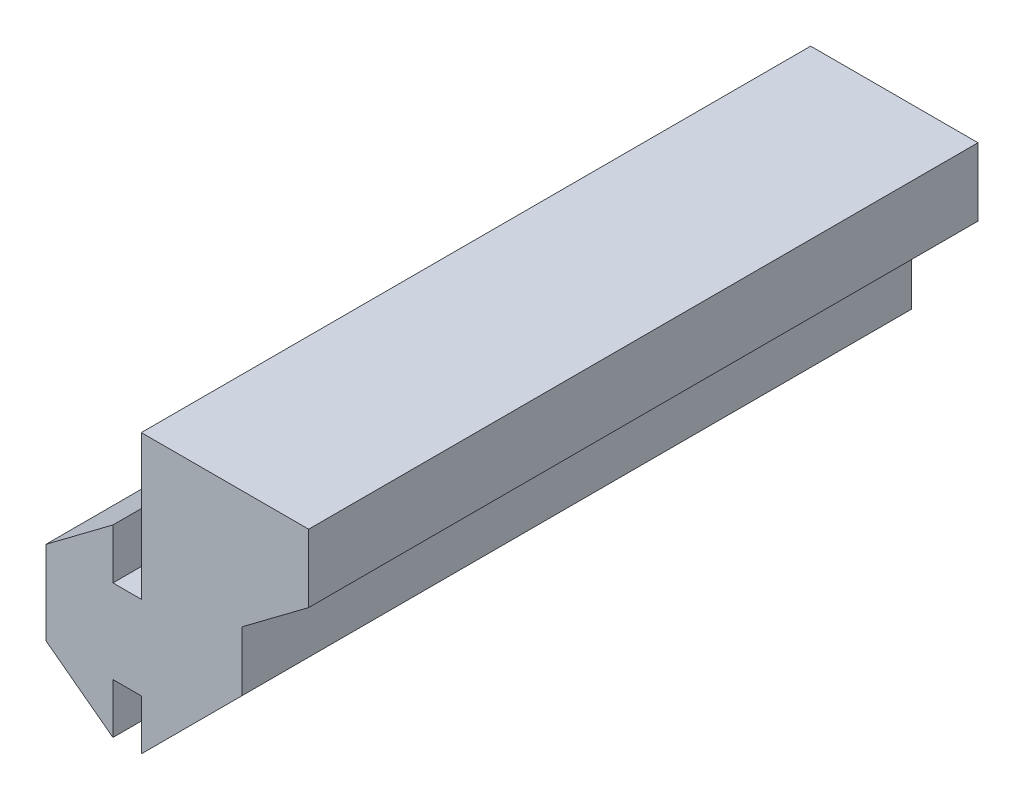
ISO-10303-21;
HEADER;
FILE_DESCRIPTION(('STEP AP214'),'2;1');
FILE_NAME('part.step','',(''),(''),'','','');
FILE_SCHEMA(('AUTOMOTIVE_DESIGN { 1 0 10303 214 1 1 1 1 }'));
ENDSEC;
DATA;
#1=APPLICATION_CONTEXT('core data for automotive mechanical design processes');
#2=APPLICATION_PROTOCOL_DEFINITION('international standard','automotive_design',2000,#1);
#3=PRODUCT_CONTEXT('',#1,'mechanical');
#4=PRODUCT('Part','Part','',(#3));
#5=PRODUCT_RELATED_PRODUCT_CATEGORY('part','',(#4));
#6=PRODUCT_DEFINITION_FORMATION('','',#4);
#7=PRODUCT_DEFINITION_CONTEXT('part definition',#1,'design');
#8=PRODUCT_DEFINITION('design','',#6,#7);
#9=PRODUCT_DEFINITION_SHAPE('','',#8);
#10=(LENGTH_UNIT() NAMED_UNIT(*) SI_UNIT(.MILLI.,.METRE.));
#11=(NAMED_UNIT(*) PLANE_ANGLE_UNIT() SI_UNIT($,.RADIAN.));
#12=(NAMED_UNIT(*) SI_UNIT($,.STERADIAN.) SOLID_ANGLE_UNIT());
#13=UNCERTAINTY_MEASURE_WITH_UNIT(LENGTH_MEASURE(1.E-05),#10,'distance_accuracy_value','');
#14=(GEOMETRIC_REPRESENTATION_CONTEXT(3) GLOBAL_UNCERTAINTY_ASSIGNED_CONTEXT((#13)) GLOBAL_UNIT_ASSIGNED_CONTEXT((#10,
#11,#12)) REPRESENTATION_CONTEXT('',''));
#15=CARTESIAN_POINT('',(0.,0.,0.));
#16=DIRECTION('',(0.,0.,1.));
#17=DIRECTION('',(1.,0.,0.));
#18=AXIS2_PLACEMENT_3D('',#15,#16,#17);
#19=CARTESIAN_POINT('',(0.,0.,40.));
#20=DIRECTION('',(0.6,0.8,0.));
#21=DIRECTION('',(-0.8,0.6,0.));
#22=AXIS2_PLACEMENT_3D('',#19,#20,#21);
#23=PLANE('',#22);
#24=DIRECTION('',(0.8,-0.6,0.));
#25=VECTOR('',#24,1.);
#26=CARTESIAN_POINT('',(0.,0.,0.));
#27=LINE('',#26,#25);
#28=CARTESIAN_POINT('',(0.,0.,0.));
#29=VERTEX_POINT('',#28);
#30=CARTESIAN_POINT('',(4.,-3.,0.));
#31=VERTEX_POINT('',#30);
#32=EDGE_CURVE('E165',#29,#31,#27,.T.);
#33=ORIENTED_EDGE('',*,*,#32,.T.);
#34=DIRECTION('',(0.,0.,-1.));
#35=VECTOR('',#34,1.);
#36=CARTESIAN_POINT('',(4.,-3.,40.));
#37=LINE('',#36,#35);
#38=CARTESIAN_POINT('',(4.,-3.,40.));
#39=VERTEX_POINT('',#38);
#40=EDGE_CURVE('E11',#39,#31,#37,.T.);
#41=ORIENTED_EDGE('',*,*,#40,.F.);
#42=DIRECTION('',(0.8,-0.6,0.));
#43=VECTOR('',#42,1.);
#44=CARTESIAN_POINT('',(0.,0.,40.));
#45=LINE('',#44,#43);
#46=CARTESIAN_POINT('',(0.,0.,40.));
#47=VERTEX_POINT('',#46);
#48=EDGE_CURVE('E191',#47,#39,#45,.T.);
#49=ORIENTED_EDGE('',*,*,#48,.F.);
#50=DIRECTION('',(0.,0.,-1.));
#51=VECTOR('',#50,1.);
#52=CARTESIAN_POINT('',(0.,0.,40.));
#53=LINE('',#52,#51);
#54=EDGE_CURVE('E161',#47,#29,#53,.T.);
#55=ORIENTED_EDGE('',*,*,#54,.T.);
#56=EDGE_LOOP('',(#33,#41,#49,#55));
#57=FACE_BOUND('',#56,.T.);
#58=ADVANCED_FACE('F33',(#57),#23,.F.);
#59=CARTESIAN_POINT('',(4.,0.,40.));
#60=DIRECTION('',(-1.,0.,0.));
#61=DIRECTION('',(0.,0.,1.));
#62=AXIS2_PLACEMENT_3D('',#59,#60,#61);
#63=PLANE('',#62);
#64=DIRECTION('',(0.,1.,0.));
#65=VECTOR('',#64,1.);
#66=CARTESIAN_POINT('',(4.,0.,0.));
#67=LINE('',#66,#65);
#68=CARTESIAN_POINT('',(4.,0.,0.));
#69=VERTEX_POINT('',#68);
#70=EDGE_CURVE('E168',#31,#69,#67,.T.);
#71=ORIENTED_EDGE('',*,*,#70,.T.);
#72=DIRECTION('',(0.,0.,-1.));
#73=VECTOR('',#72,1.);
#74=CARTESIAN_POINT('',(4.,0.,40.));
#75=LINE('',#74,#73);
#76=CARTESIAN_POINT('',(4.,0.,40.));
#77=VERTEX_POINT('',#76);
#78=EDGE_CURVE('E41',#77,#69,#75,.T.);
#79=ORIENTED_EDGE('',*,*,#78,.F.);
#80=DIRECTION('',(0.,1.,0.));
#81=VECTOR('',#80,1.);
#82=CARTESIAN_POINT('',(4.,0.,40.));
#83=LINE('',#82,#81);
#84=EDGE_CURVE('E110',#39,#77,#83,.T.);
#85=ORIENTED_EDGE('',*,*,#84,.F.);
#86=ORIENTED_EDGE('',*,*,#40,.T.);
#87=EDGE_LOOP('',(#71,#79,#85,#86));
#88=FACE_BOUND('',#87,.T.);
#89=ADVANCED_FACE('F279',(#88),#63,.F.);
#90=CARTESIAN_POINT('',(5.69584116590784,0.,40.));
#91=DIRECTION('',(0.,1.,0.));
#92=DIRECTION('',(0.,0.,1.));
#93=AXIS2_PLACEMENT_3D('',#90,#91,#92);
#94=PLANE('',#93);
#95=DIRECTION('',(1.,0.,0.));
#96=VECTOR('',#95,1.);
#97=CARTESIAN_POINT('',(5.69584116590784,0.,0.));
#98=LINE('',#97,#96);
#99=CARTESIAN_POINT('',(5.69584116590784,0.,0.));
#100=VERTEX_POINT('',#99);
#101=EDGE_CURVE('E170',#69,#100,#98,.T.);
#102=ORIENTED_EDGE('',*,*,#101,.T.);
#103=DIRECTION('',(0.,0.,-1.));
#104=VECTOR('',#103,1.);
#105=CARTESIAN_POINT('',(5.69584116590784,0.,40.));
#106=LINE('',#105,#104);
#107=CARTESIAN_POINT('',(5.69584116590784,0.,40.));
#108=VERTEX_POINT('',#107);
#109=EDGE_CURVE('E216',#108,#100,#106,.T.);
#110=ORIENTED_EDGE('',*,*,#109,.F.);
#111=DIRECTION('',(1.,0.,0.));
#112=VECTOR('',#111,1.);
#113=CARTESIAN_POINT('',(5.69584116590784,0.,40.));
#114=LINE('',#113,#112);
#115=EDGE_CURVE('E224',#77,#108,#114,.T.);
#116=ORIENTED_EDGE('',*,*,#115,.F.);
#117=ORIENTED_EDGE('',*,*,#78,.T.);
#118=EDGE_LOOP('',(#102,#110,#116,#117));
#119=FACE_BOUND('',#118,.T.);
#120=ADVANCED_FACE('F222',(#119),#94,.F.);
#121=CARTESIAN_POINT('',(5.69584116590784,0.,40.));
#122=DIRECTION('',(1.,0.,0.));
#123=DIRECTION('',(0.,0.,-1.));
#124=AXIS2_PLACEMENT_3D('',#121,#122,#123);
#125=PLANE('',#124);
#126=DIRECTION('',(0.,-1.,0.));
#127=VECTOR('',#126,1.);
#128=CARTESIAN_POINT('',(5.69584116590784,0.,0.));
#129=LINE('',#128,#127);
#130=CARTESIAN_POINT('',(5.69584116590784,-3.,0.));
#131=VERTEX_POINT('',#130);
#132=EDGE_CURVE('E172',#100,#131,#129,.T.);
#133=ORIENTED_EDGE('',*,*,#132,.T.);
#134=DIRECTION('',(0.,0.,-1.));
#135=VECTOR('',#134,1.);
#136=CARTESIAN_POINT('',(5.69584116590784,-3.,40.));
#137=LINE('',#136,#135);
#138=CARTESIAN_POINT('',(5.69584116590784,-3.,40.));
#139=VERTEX_POINT('',#138);
#140=EDGE_CURVE('E213',#139,#131,#137,.T.);
#141=ORIENTED_EDGE('',*,*,#140,.F.);
#142=DIRECTION('',(0.,-1.,0.));
#143=VECTOR('',#142,1.);
#144=CARTESIAN_POINT('',(5.69584116590784,0.,40.));
#145=LINE('',#144,#143);
#146=EDGE_CURVE('E242',#108,#139,#145,.T.);
#147=ORIENTED_EDGE('',*,*,#146,.F.);
#148=ORIENTED_EDGE('',*,*,#109,.T.);
#149=EDGE_LOOP('',(#133,#141,#147,#148));
#150=FACE_BOUND('',#149,.T.);
#151=ADVANCED_FACE('F233',(#150),#125,.F.);
#152=CARTESIAN_POINT('',(5.69584116590784,-3.,40.));
#153=DIRECTION('',(-0.707106781186552,0.707106781186544,0.));
#154=DIRECTION('',(-0.707106781186544,-0.707106781186552,0.));
#155=AXIS2_PLACEMENT_3D('',#152,#153,#154);
#156=PLANE('',#155);
#157=DIRECTION('',(0.707106781186543,0.707106781186551,0.));
#158=VECTOR('',#157,1.);
#159=CARTESIAN_POINT('',(5.69584116590784,-3.,0.));
#160=LINE('',#159,#158);
#161=CARTESIAN_POINT('',(11.7102313633152,3.01439019740739,0.));
#162=VERTEX_POINT('',#161);
#163=EDGE_CURVE('E174',#131,#162,#160,.T.);
#164=ORIENTED_EDGE('',*,*,#163,.T.);
#165=DIRECTION('',(0.,0.,-1.));
#166=VECTOR('',#165,1.);
#167=CARTESIAN_POINT('',(11.7102313633152,3.01439019740739,40.));
#168=LINE('',#167,#166);
#169=CARTESIAN_POINT('',(11.7102313633152,3.01439019740739,40.));
#170=VERTEX_POINT('',#169);
#171=EDGE_CURVE('E210',#170,#162,#168,.T.);
#172=ORIENTED_EDGE('',*,*,#171,.F.);
#173=DIRECTION('',(0.707106781186543,0.707106781186551,0.));
#174=VECTOR('',#173,1.);
#175=CARTESIAN_POINT('',(5.69584116590784,-3.,40.));
#176=LINE('',#175,#174);
#177=EDGE_CURVE('E239',#139,#170,#176,.T.);
#178=ORIENTED_EDGE('',*,*,#177,.F.);
#179=ORIENTED_EDGE('',*,*,#140,.T.);
#180=EDGE_LOOP('',(#164,#172,#178,#179));
#181=FACE_BOUND('',#180,.T.);
#182=ADVANCED_FACE('F237',(#181),#156,.F.);
#183=CARTESIAN_POINT('',(11.7102313633152,3.01439019740739,40.));
#184=DIRECTION('',(-1.,0.,0.));
#185=DIRECTION('',(0.,-1.,0.));
#186=AXIS2_PLACEMENT_3D('',#183,#184,#185);
#187=PLANE('',#186);
#188=DIRECTION('',(0.,1.,0.));
#189=VECTOR('',#188,1.);
#190=CARTESIAN_POINT('',(11.7102313633152,3.01439019740739,0.));
#191=LINE('',#190,#189);
#192=CARTESIAN_POINT('',(11.7102313633152,6.58190306377795,0.));
#193=VERTEX_POINT('',#192);
#194=EDGE_CURVE('E176',#162,#193,#191,.T.);
#195=ORIENTED_EDGE('',*,*,#194,.T.);
#196=DIRECTION('',(0.,0.,-1.));
#197=VECTOR('',#196,1.);
#198=CARTESIAN_POINT('',(11.7102313633152,6.58190306377795,40.));
#199=LINE('',#198,#197);
#200=CARTESIAN_POINT('',(11.7102313633152,6.58190306377795,40.));
#201=VERTEX_POINT('',#200);
#202=EDGE_CURVE('E207',#201,#193,#199,.T.);
#203=ORIENTED_EDGE('',*,*,#202,.F.);
#204=DIRECTION('',(0.,1.,0.));
#205=VECTOR('',#204,1.);
#206=CARTESIAN_POINT('',(11.7102313633152,3.01439019740739,40.));
#207=LINE('',#206,#205);
#208=EDGE_CURVE('E241',#170,#201,#207,.T.);
#209=ORIENTED_EDGE('',*,*,#208,.F.);
#210=ORIENTED_EDGE('',*,*,#171,.T.);
#211=EDGE_LOOP('',(#195,#203,#209,#210));
#212=FACE_BOUND('',#211,.T.);
#213=ADVANCED_FACE('F292',(#212),#187,.F.);
#214=CARTESIAN_POINT('',(11.7102313633152,6.58190306377795,40.));
#215=DIRECTION('',(-0.6,0.8,0.));
#216=DIRECTION('',(-0.8,-0.6,0.));
#217=AXIS2_PLACEMENT_3D('',#214,#215,#216);
#218=PLANE('',#217);
#219=DIRECTION('',(0.8,0.6,0.));
#220=VECTOR('',#219,1.);
#221=CARTESIAN_POINT('',(11.7102313633152,6.58190306377795,0.));
#222=LINE('',#221,#220);
#223=CARTESIAN_POINT('',(15.6958411659078,9.57111041572246,0.));
#224=VERTEX_POINT('',#223);
#225=EDGE_CURVE('E178',#193,#224,#222,.T.);
#226=ORIENTED_EDGE('',*,*,#225,.T.);
#227=DIRECTION('',(0.,0.,-1.));
#228=VECTOR('',#227,1.);
#229=CARTESIAN_POINT('',(15.6958411659078,9.57111041572246,40.));
#230=LINE('',#229,#228);
#231=CARTESIAN_POINT('',(15.6958411659078,9.57111041572246,40.));
#232=VERTEX_POINT('',#231);
#233=EDGE_CURVE('E204',#232,#224,#230,.T.);
#234=ORIENTED_EDGE('',*,*,#233,.F.);
#235=DIRECTION('',(0.8,0.6,0.));
#236=VECTOR('',#235,1.);
#237=CARTESIAN_POINT('',(11.7102313633152,6.58190306377795,40.));
#238=LINE('',#237,#236);
#239=EDGE_CURVE('E244',#201,#232,#238,.T.);
#240=ORIENTED_EDGE('',*,*,#239,.F.);
#241=ORIENTED_EDGE('',*,*,#202,.T.);
#242=EDGE_LOOP('',(#226,#234,#240,#241));
#243=FACE_BOUND('',#242,.T.);
#244=ADVANCED_FACE('F295',(#243),#218,.F.);
#245=CARTESIAN_POINT('',(15.6958411659078,9.57111041572246,40.));
#246=DIRECTION('',(-1.,0.,0.));
#247=DIRECTION('',(0.,0.,1.));
#248=AXIS2_PLACEMENT_3D('',#245,#246,#247);
#249=PLANE('',#248);
#250=DIRECTION('',(0.,1.,0.));
#251=VECTOR('',#250,1.);
#252=CARTESIAN_POINT('',(15.6958411659078,9.57111041572246,0.));
#253=LINE('',#252,#251);
#254=CARTESIAN_POINT('',(15.6958411659078,13.6284249506141,0.));
#255=VERTEX_POINT('',#254);
#256=EDGE_CURVE('E180',#224,#255,#253,.T.);
#257=ORIENTED_EDGE('',*,*,#256,.T.);
#258=DIRECTION('',(0.,0.,-1.));
#259=VECTOR('',#258,1.);
#260=CARTESIAN_POINT('',(15.6958411659078,13.6284249506141,40.));
#261=LINE('',#260,#259);
#262=CARTESIAN_POINT('',(15.6958411659078,13.6284249506141,40.));
#263=VERTEX_POINT('',#262);
#264=EDGE_CURVE('E201',#263,#255,#261,.T.);
#265=ORIENTED_EDGE('',*,*,#264,.F.);
#266=DIRECTION('',(0.,1.,0.));
#267=VECTOR('',#266,1.);
#268=CARTESIAN_POINT('',(15.6958411659078,9.57111041572246,40.));
#269=LINE('',#268,#267);
#270=EDGE_CURVE('E250',#232,#263,#269,.T.);
#271=ORIENTED_EDGE('',*,*,#270,.F.);
#272=ORIENTED_EDGE('',*,*,#233,.T.);
#273=EDGE_LOOP('',(#257,#265,#271,#272));
#274=FACE_BOUND('',#273,.T.);
#275=ADVANCED_FACE('F299',(#274),#249,.F.);
#276=CARTESIAN_POINT('',(15.6958411659078,13.6284249506141,40.));
#277=DIRECTION('',(0.,-1.,0.));
#278=DIRECTION('',(1.,0.,0.));
#279=AXIS2_PLACEMENT_3D('',#276,#277,#278);
#280=PLANE('',#279);
#281=DIRECTION('',(-1.,0.,0.));
#282=VECTOR('',#281,1.);
#283=CARTESIAN_POINT('',(15.6958411659078,13.6284249506141,0.));
#284=LINE('',#283,#282);
#285=CARTESIAN_POINT('',(5.69584116590784,13.6284249506141,0.));
#286=VERTEX_POINT('',#285);
#287=EDGE_CURVE('E182',#255,#286,#284,.T.);
#288=ORIENTED_EDGE('',*,*,#287,.T.);
#289=DIRECTION('',(0.,0.,-1.));
#290=VECTOR('',#289,1.);
#291=CARTESIAN_POINT('',(5.69584116590784,13.6284249506141,40.));
#292=LINE('',#291,#290);
#293=CARTESIAN_POINT('',(5.69584116590784,13.6284249506141,40.));
#294=VERTEX_POINT('',#293);
#295=EDGE_CURVE('E198',#294,#286,#292,.T.);
#296=ORIENTED_EDGE('',*,*,#295,.F.);
#297=DIRECTION('',(-1.,0.,0.));
#298=VECTOR('',#297,1.);
#299=CARTESIAN_POINT('',(15.6958411659078,13.6284249506141,40.));
#300=LINE('',#299,#298);
#301=EDGE_CURVE('E252',#263,#294,#300,.T.);
#302=ORIENTED_EDGE('',*,*,#301,.F.);
#303=ORIENTED_EDGE('',*,*,#264,.T.);
#304=EDGE_LOOP('',(#288,#296,#302,#303));
#305=FACE_BOUND('',#304,.T.);
#306=ADVANCED_FACE('F303',(#305),#280,.F.);
#307=CARTESIAN_POINT('',(5.69584116590784,13.6284249506141,40.));
#308=DIRECTION('',(1.,0.,0.));
#309=DIRECTION('',(0.,0.,-1.));
#310=AXIS2_PLACEMENT_3D('',#307,#308,#309);
#311=PLANE('',#310);
#312=DIRECTION('',(0.,-1.,0.));
#313=VECTOR('',#312,1.);
#314=CARTESIAN_POINT('',(5.69584116590784,13.6284249506141,0.));
#315=LINE('',#314,#313);
#316=CARTESIAN_POINT('',(5.69584116590784,5.,0.));
#317=VERTEX_POINT('',#316);
#318=EDGE_CURVE('E184',#286,#317,#315,.T.);
#319=ORIENTED_EDGE('',*,*,#318,.T.);
#320=DIRECTION('',(0.,0.,-1.));
#321=VECTOR('',#320,1.);
#322=CARTESIAN_POINT('',(5.69584116590784,5.,40.));
#323=LINE('',#322,#321);
#324=CARTESIAN_POINT('',(5.69584116590784,5.,40.));
#325=VERTEX_POINT('',#324);
#326=EDGE_CURVE('E195',#325,#317,#323,.T.);
#327=ORIENTED_EDGE('',*,*,#326,.F.);
#328=DIRECTION('',(0.,-1.,0.));
#329=VECTOR('',#328,1.);
#330=CARTESIAN_POINT('',(5.69584116590784,13.6284249506141,40.));
#331=LINE('',#330,#329);
#332=EDGE_CURVE('E254',#294,#325,#331,.T.);
#333=ORIENTED_EDGE('',*,*,#332,.F.);
#334=ORIENTED_EDGE('',*,*,#295,.T.);
#335=EDGE_LOOP('',(#319,#327,#333,#334));
#336=FACE_BOUND('',#335,.T.);
#337=ADVANCED_FACE('F260',(#336),#311,.F.);
#338=CARTESIAN_POINT('',(4.,5.,40.));
#339=DIRECTION('',(0.,-1.,0.));
#340=DIRECTION('',(0.,0.,-1.));
#341=AXIS2_PLACEMENT_3D('',#338,#339,#340);
#342=PLANE('',#341);
#343=DIRECTION('',(-1.,0.,0.));
#344=VECTOR('',#343,1.);
#345=CARTESIAN_POINT('',(4.,5.,0.));
#346=LINE('',#345,#344);
#347=CARTESIAN_POINT('',(4.,5.,0.));
#348=VERTEX_POINT('',#347);
#349=EDGE_CURVE('E186',#317,#348,#346,.T.);
#350=ORIENTED_EDGE('',*,*,#349,.T.);
#351=DIRECTION('',(0.,0.,-1.));
#352=VECTOR('',#351,1.);
#353=CARTESIAN_POINT('',(4.,5.,40.));
#354=LINE('',#353,#352);
#355=CARTESIAN_POINT('',(4.,5.,40.));
#356=VERTEX_POINT('',#355);
#357=EDGE_CURVE('E156',#356,#348,#354,.T.);
#358=ORIENTED_EDGE('',*,*,#357,.F.);
#359=DIRECTION('',(-1.,0.,0.));
#360=VECTOR('',#359,1.);
#361=CARTESIAN_POINT('',(4.,5.,40.));
#362=LINE('',#361,#360);
#363=EDGE_CURVE('E147',#325,#356,#362,.T.);
#364=ORIENTED_EDGE('',*,*,#363,.F.);
#365=ORIENTED_EDGE('',*,*,#326,.T.);
#366=EDGE_LOOP('',(#350,#358,#364,#365));
#367=FACE_BOUND('',#366,.T.);
#368=ADVANCED_FACE('F264',(#367),#342,.F.);
#369=CARTESIAN_POINT('',(4.,8.,40.));
#370=DIRECTION('',(-1.,0.,0.));
#371=DIRECTION('',(0.,0.,1.));
#372=AXIS2_PLACEMENT_3D('',#369,#370,#371);
#373=PLANE('',#372);
#374=DIRECTION('',(0.,1.,0.));
#375=VECTOR('',#374,1.);
#376=CARTESIAN_POINT('',(4.,8.,0.));
#377=LINE('',#376,#375);
#378=CARTESIAN_POINT('',(4.,8.,0.));
#379=VERTEX_POINT('',#378);
#380=EDGE_CURVE('E155',#348,#379,#377,.T.);
#381=ORIENTED_EDGE('',*,*,#380,.T.);
#382=DIRECTION('',(0.,0.,-1.));
#383=VECTOR('',#382,1.);
#384=CARTESIAN_POINT('',(4.,8.,40.));
#385=LINE('',#384,#383);
#386=CARTESIAN_POINT('',(4.,8.,40.));
#387=VERTEX_POINT('',#386);
#388=EDGE_CURVE('E152',#387,#379,#385,.T.);
#389=ORIENTED_EDGE('',*,*,#388,.F.);
#390=DIRECTION('',(0.,1.,0.));
#391=VECTOR('',#390,1.);
#392=CARTESIAN_POINT('',(4.,8.,40.));
#393=LINE('',#392,#391);
#394=EDGE_CURVE('E141',#356,#387,#393,.T.);
#395=ORIENTED_EDGE('',*,*,#394,.F.);
#396=ORIENTED_EDGE('',*,*,#357,.T.);
#397=EDGE_LOOP('',(#381,#389,#395,#396));
#398=FACE_BOUND('',#397,.T.);
#399=ADVANCED_FACE('F153',(#398),#373,.F.);
#400=CARTESIAN_POINT('',(0.,5.,40.));
#401=DIRECTION('',(0.6,-0.8,0.));
#402=DIRECTION('',(0.8,0.6,0.));
#403=AXIS2_PLACEMENT_3D('',#400,#401,#402);
#404=PLANE('',#403);
#405=DIRECTION('',(-0.8,-0.6,0.));
#406=VECTOR('',#405,1.);
#407=CARTESIAN_POINT('',(0.,5.,0.));
#408=LINE('',#407,#406);
#409=CARTESIAN_POINT('',(0.,5.,0.));
#410=VERTEX_POINT('',#409);
#411=EDGE_CURVE('E96',#379,#410,#408,.T.);
#412=ORIENTED_EDGE('',*,*,#411,.T.);
#413=DIRECTION('',(0.,0.,-1.));
#414=VECTOR('',#413,1.);
#415=CARTESIAN_POINT('',(0.,5.,40.));
#416=LINE('',#415,#414);
#417=CARTESIAN_POINT('',(0.,5.,40.));
#418=VERTEX_POINT('',#417);
#419=EDGE_CURVE('E157',#418,#410,#416,.T.);
#420=ORIENTED_EDGE('',*,*,#419,.F.);
#421=DIRECTION('',(-0.8,-0.6,0.));
#422=VECTOR('',#421,1.);
#423=CARTESIAN_POINT('',(0.,5.,40.));
#424=LINE('',#423,#422);
#425=EDGE_CURVE('E145',#387,#418,#424,.T.);
#426=ORIENTED_EDGE('',*,*,#425,.F.);
#427=ORIENTED_EDGE('',*,*,#388,.T.);
#428=EDGE_LOOP('',(#412,#420,#426,#427));
#429=FACE_BOUND('',#428,.T.);
#430=ADVANCED_FACE('F159',(#429),#404,.F.);
#431=CARTESIAN_POINT('',(0.,0.,40.));
#432=DIRECTION('',(1.,0.,0.));
#433=DIRECTION('',(0.,0.,-1.));
#434=AXIS2_PLACEMENT_3D('',#431,#432,#433);
#435=PLANE('',#434);
#436=DIRECTION('',(0.,-1.,0.));
#437=VECTOR('',#436,1.);
#438=CARTESIAN_POINT('',(0.,0.,0.));
#439=LINE('',#438,#437);
#440=EDGE_CURVE('E102',#410,#29,#439,.T.);
#441=ORIENTED_EDGE('',*,*,#440,.T.);
#442=ORIENTED_EDGE('',*,*,#54,.F.);
#443=DIRECTION('',(0.,-1.,0.));
#444=VECTOR('',#443,1.);
#445=CARTESIAN_POINT('',(0.,0.,40.));
#446=LINE('',#445,#444);
#447=EDGE_CURVE('E49',#418,#47,#446,.T.);
#448=ORIENTED_EDGE('',*,*,#447,.F.);
#449=ORIENTED_EDGE('',*,*,#419,.T.);
#450=EDGE_LOOP('',(#441,#442,#448,#449));
#451=FACE_BOUND('',#450,.T.);
#452=ADVANCED_FACE('F268',(#451),#435,.F.);
#453=CARTESIAN_POINT('',(0.,0.,40.));
#454=DIRECTION('',(0.,0.,1.));
#455=DIRECTION('',(1.,0.,0.));
#456=AXIS2_PLACEMENT_3D('',#453,#454,#455);
#457=PLANE('',#456);
#458=ORIENTED_EDGE('',*,*,#48,.T.);
#459=ORIENTED_EDGE('',*,*,#84,.T.);
#460=ORIENTED_EDGE('',*,*,#115,.T.);
#461=ORIENTED_EDGE('',*,*,#146,.T.);
#462=ORIENTED_EDGE('',*,*,#177,.T.);
#463=ORIENTED_EDGE('',*,*,#208,.T.);
#464=ORIENTED_EDGE('',*,*,#239,.T.);
#465=ORIENTED_EDGE('',*,*,#270,.T.);
#466=ORIENTED_EDGE('',*,*,#301,.T.);
#467=ORIENTED_EDGE('',*,*,#332,.T.);
#468=ORIENTED_EDGE('',*,*,#363,.T.);
#469=ORIENTED_EDGE('',*,*,#394,.T.);
#470=ORIENTED_EDGE('',*,*,#425,.T.);
#471=ORIENTED_EDGE('',*,*,#447,.T.);
#472=EDGE_LOOP('',(#458,#459,#460,#461,#462,#463,#464,#465,#466,#467,#468,#469,#470,#471));
#473=FACE_BOUND('',#472,.T.);
#474=ADVANCED_FACE('F143',(#473),#457,.T.);
#475=CARTESIAN_POINT('',(0.,0.,0.));
#476=DIRECTION('',(0.,0.,1.));
#477=DIRECTION('',(1.,0.,0.));
#478=AXIS2_PLACEMENT_3D('',#475,#476,#477);
#479=PLANE('',#478);
#480=ORIENTED_EDGE('',*,*,#32,.F.);
#481=ORIENTED_EDGE('',*,*,#440,.F.);
#482=ORIENTED_EDGE('',*,*,#411,.F.);
#483=ORIENTED_EDGE('',*,*,#380,.F.);
#484=ORIENTED_EDGE('',*,*,#349,.F.);
#485=ORIENTED_EDGE('',*,*,#318,.F.);
#486=ORIENTED_EDGE('',*,*,#287,.F.);
#487=ORIENTED_EDGE('',*,*,#256,.F.);
#488=ORIENTED_EDGE('',*,*,#225,.F.);
#489=ORIENTED_EDGE('',*,*,#194,.F.);
#490=ORIENTED_EDGE('',*,*,#163,.F.);
#491=ORIENTED_EDGE('',*,*,#132,.F.);
#492=ORIENTED_EDGE('',*,*,#101,.F.);
#493=ORIENTED_EDGE('',*,*,#70,.F.);
#494=EDGE_LOOP('',(#480,#481,#482,#483,#484,#485,#486,#487,#488,#489,#490,#491,#492,#493));
#495=FACE_BOUND('',#494,.T.);
#496=ADVANCED_FACE('F228',(#495),#479,.F.);
#497=CLOSED_SHELL('',(#58,#89,#120,#151,#182,#213,#244,#275,#306,#337,#368,#399,#430,#452,#474,#496));
#498=MANIFOLD_SOLID_BREP('B2',#497);
#499=ADVANCED_BREP_SHAPE_REPRESENTATION('',(#18,#498),#14);
#500=SHAPE_DEFINITION_REPRESENTATION(#9,#499);
ENDSEC;
END-ISO-10303-21;
